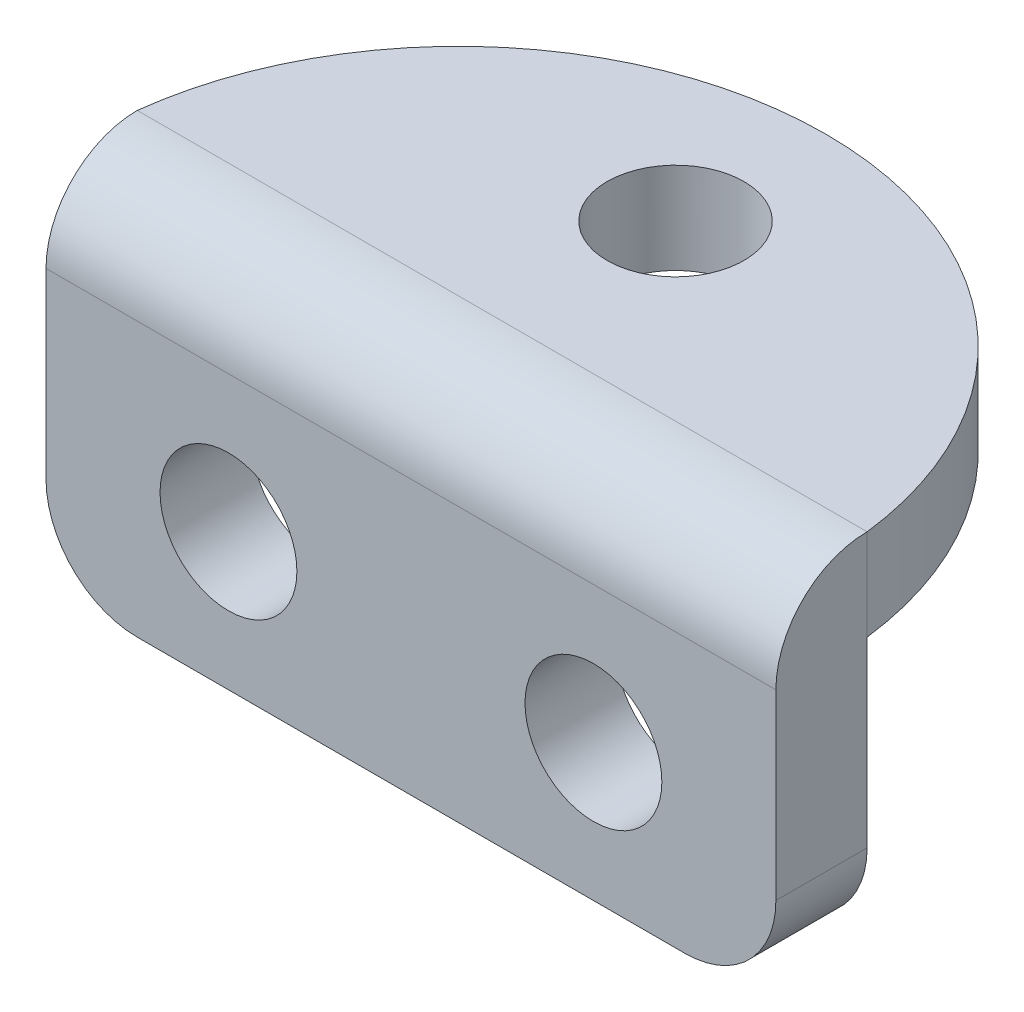
ISO-10303-21;
HEADER;
FILE_DESCRIPTION(('STEP AP214'),'2;1');
FILE_NAME('part.step','',(''),(''),'','','');
FILE_SCHEMA(('AUTOMOTIVE_DESIGN { 1 0 10303 214 1 1 1 1 }'));
ENDSEC;
DATA;
#1=APPLICATION_CONTEXT('core data for automotive mechanical design processes');
#2=APPLICATION_PROTOCOL_DEFINITION('international standard','automotive_design',2000,#1);
#3=PRODUCT_CONTEXT('',#1,'mechanical');
#4=PRODUCT('Part','Part','',(#3));
#5=PRODUCT_RELATED_PRODUCT_CATEGORY('part','',(#4));
#6=PRODUCT_DEFINITION_FORMATION('','',#4);
#7=PRODUCT_DEFINITION_CONTEXT('part definition',#1,'design');
#8=PRODUCT_DEFINITION('design','',#6,#7);
#9=PRODUCT_DEFINITION_SHAPE('','',#8);
#10=(LENGTH_UNIT() NAMED_UNIT(*) SI_UNIT(.MILLI.,.METRE.));
#11=(NAMED_UNIT(*) PLANE_ANGLE_UNIT() SI_UNIT($,.RADIAN.));
#12=(NAMED_UNIT(*) SI_UNIT($,.STERADIAN.) SOLID_ANGLE_UNIT());
#13=UNCERTAINTY_MEASURE_WITH_UNIT(LENGTH_MEASURE(1.E-05),#10,'distance_accuracy_value','');
#14=(GEOMETRIC_REPRESENTATION_CONTEXT(3) GLOBAL_UNCERTAINTY_ASSIGNED_CONTEXT((#13)) GLOBAL_UNIT_ASSIGNED_CONTEXT((#10,
#11,#12)) REPRESENTATION_CONTEXT('',''));
#15=CARTESIAN_POINT('',(0.,0.,0.));
#16=DIRECTION('',(0.,0.,1.));
#17=DIRECTION('',(1.,0.,0.));
#18=AXIS2_PLACEMENT_3D('',#15,#16,#17);
#19=CARTESIAN_POINT('',(0.,0.,2.));
#20=DIRECTION('',(1.,0.,0.));
#21=DIRECTION('',(0.,1.,0.));
#22=AXIS2_PLACEMENT_3D('',#19,#20,#21);
#23=PLANE('',#22);
#24=DIRECTION('',(0.,-1.,0.));
#25=VECTOR('',#24,1.);
#26=CARTESIAN_POINT('',(0.,0.,0.));
#27=LINE('',#26,#25);
#28=CARTESIAN_POINT('',(0.,2.,0.));
#29=VERTEX_POINT('',#28);
#30=CARTESIAN_POINT('',(0.,0.,0.));
#31=VERTEX_POINT('',#30);
#32=EDGE_CURVE('E112',#29,#31,#27,.T.);
#33=ORIENTED_EDGE('',*,*,#32,.T.);
#34=CARTESIAN_POINT('',(0.,-4.,0.));
#35=VERTEX_POINT('',#34);
#36=EDGE_CURVE('E116',#31,#35,#27,.T.);
#37=ORIENTED_EDGE('',*,*,#36,.T.);
#38=DIRECTION('',(0.,0.,-1.));
#39=VECTOR('',#38,1.);
#40=CARTESIAN_POINT('',(0.,-4.,2.));
#41=LINE('',#40,#39);
#42=CARTESIAN_POINT('',(0.,-4.,2.));
#43=VERTEX_POINT('',#42);
#44=EDGE_CURVE('E11',#43,#35,#41,.T.);
#45=ORIENTED_EDGE('',*,*,#44,.F.);
#46=DIRECTION('',(0.,-1.,0.));
#47=VECTOR('',#46,1.);
#48=CARTESIAN_POINT('',(0.,0.,2.));
#49=LINE('',#48,#47);
#50=CARTESIAN_POINT('',(0.,0.,2.));
#51=VERTEX_POINT('',#50);
#52=EDGE_CURVE('E86',#51,#43,#49,.T.);
#53=ORIENTED_EDGE('',*,*,#52,.F.);
#54=CARTESIAN_POINT('',(0.,0.,0.));
#55=DIRECTION('',(-1.,0.,0.));
#56=DIRECTION('',(0.,-1.,0.));
#57=AXIS2_PLACEMENT_3D('',#54,#55,#56);
#58=CIRCLE('',#57,2.);
#59=EDGE_CURVE('E162',#51,#29,#58,.T.);
#60=ORIENTED_EDGE('',*,*,#59,.T.);
#61=EDGE_LOOP('',(#33,#37,#45,#53,#60));
#62=FACE_BOUND('',#61,.T.);
#63=ADVANCED_FACE('F36',(#62),#23,.F.);
#64=CARTESIAN_POINT('',(2.,-4.,2.));
#65=DIRECTION('',(0.,0.,-1.));
#66=DIRECTION('',(-1.,0.,0.));
#67=AXIS2_PLACEMENT_3D('',#64,#65,#66);
#68=CYLINDRICAL_SURFACE('',#67,2.);
#69=CARTESIAN_POINT('',(2.,-4.,0.));
#70=DIRECTION('',(0.,0.,1.));
#71=DIRECTION('',(1.,0.,0.));
#72=AXIS2_PLACEMENT_3D('',#69,#70,#71);
#73=CIRCLE('',#72,2.);
#74=CARTESIAN_POINT('',(2.,-6.,0.));
#75=VERTEX_POINT('',#74);
#76=EDGE_CURVE('E115',#35,#75,#73,.T.);
#77=ORIENTED_EDGE('',*,*,#76,.T.);
#78=DIRECTION('',(0.,0.,-1.));
#79=VECTOR('',#78,1.);
#80=CARTESIAN_POINT('',(2.,-6.,2.));
#81=LINE('',#80,#79);
#82=CARTESIAN_POINT('',(2.,-6.,2.));
#83=VERTEX_POINT('',#82);
#84=EDGE_CURVE('E44',#83,#75,#81,.T.);
#85=ORIENTED_EDGE('',*,*,#84,.F.);
#86=CARTESIAN_POINT('',(2.,-4.,2.));
#87=DIRECTION('',(0.,0.,1.));
#88=DIRECTION('',(1.,0.,0.));
#89=AXIS2_PLACEMENT_3D('',#86,#87,#88);
#90=CIRCLE('',#89,2.);
#91=EDGE_CURVE('E100',#43,#83,#90,.T.);
#92=ORIENTED_EDGE('',*,*,#91,.F.);
#93=ORIENTED_EDGE('',*,*,#44,.T.);
#94=EDGE_LOOP('',(#77,#85,#92,#93));
#95=FACE_BOUND('',#94,.T.);
#96=ADVANCED_FACE('F185',(#95),#68,.T.);
#97=CARTESIAN_POINT('',(2.,-6.,2.));
#98=DIRECTION('',(0.,1.,0.));
#99=DIRECTION('',(0.,0.,1.));
#100=AXIS2_PLACEMENT_3D('',#97,#98,#99);
#101=PLANE('',#100);
#102=DIRECTION('',(1.,0.,0.));
#103=VECTOR('',#102,1.);
#104=CARTESIAN_POINT('',(2.,-6.,0.));
#105=LINE('',#104,#103);
#106=CARTESIAN_POINT('',(14.,-6.,0.));
#107=VERTEX_POINT('',#106);
#108=EDGE_CURVE('E70',#75,#107,#105,.T.);
#109=ORIENTED_EDGE('',*,*,#108,.T.);
#110=DIRECTION('',(0.,0.,-1.));
#111=VECTOR('',#110,1.);
#112=CARTESIAN_POINT('',(14.,-6.,2.));
#113=LINE('',#112,#111);
#114=CARTESIAN_POINT('',(14.,-6.,2.));
#115=VERTEX_POINT('',#114);
#116=EDGE_CURVE('E103',#115,#107,#113,.T.);
#117=ORIENTED_EDGE('',*,*,#116,.F.);
#118=DIRECTION('',(1.,0.,0.));
#119=VECTOR('',#118,1.);
#120=CARTESIAN_POINT('',(2.,-6.,2.));
#121=LINE('',#120,#119);
#122=EDGE_CURVE('E95',#83,#115,#121,.T.);
#123=ORIENTED_EDGE('',*,*,#122,.F.);
#124=ORIENTED_EDGE('',*,*,#84,.T.);
#125=EDGE_LOOP('',(#109,#117,#123,#124));
#126=FACE_BOUND('',#125,.T.);
#127=ADVANCED_FACE('F104',(#126),#101,.F.);
#128=CARTESIAN_POINT('',(14.,-4.,2.));
#129=DIRECTION('',(0.,0.,-1.));
#130=DIRECTION('',(-1.,0.,0.));
#131=AXIS2_PLACEMENT_3D('',#128,#129,#130);
#132=CYLINDRICAL_SURFACE('',#131,2.);
#133=CARTESIAN_POINT('',(14.,-4.,0.));
#134=DIRECTION('',(0.,0.,1.));
#135=DIRECTION('',(-1.,0.,0.));
#136=AXIS2_PLACEMENT_3D('',#133,#134,#135);
#137=CIRCLE('',#136,2.);
#138=CARTESIAN_POINT('',(16.,-4.,0.));
#139=VERTEX_POINT('',#138);
#140=EDGE_CURVE('E77',#107,#139,#137,.T.);
#141=ORIENTED_EDGE('',*,*,#140,.T.);
#142=DIRECTION('',(0.,0.,-1.));
#143=VECTOR('',#142,1.);
#144=CARTESIAN_POINT('',(16.,-4.,2.));
#145=LINE('',#144,#143);
#146=CARTESIAN_POINT('',(16.,-4.,2.));
#147=VERTEX_POINT('',#146);
#148=EDGE_CURVE('E105',#147,#139,#145,.T.);
#149=ORIENTED_EDGE('',*,*,#148,.F.);
#150=CARTESIAN_POINT('',(14.,-4.,2.));
#151=DIRECTION('',(0.,0.,1.));
#152=DIRECTION('',(-1.,0.,0.));
#153=AXIS2_PLACEMENT_3D('',#150,#151,#152);
#154=CIRCLE('',#153,2.);
#155=EDGE_CURVE('E98',#115,#147,#154,.T.);
#156=ORIENTED_EDGE('',*,*,#155,.F.);
#157=ORIENTED_EDGE('',*,*,#116,.T.);
#158=EDGE_LOOP('',(#141,#149,#156,#157));
#159=FACE_BOUND('',#158,.T.);
#160=ADVANCED_FACE('F107',(#159),#132,.T.);
#161=CARTESIAN_POINT('',(16.,-4.,2.));
#162=DIRECTION('',(-1.,0.,0.));
#163=DIRECTION('',(0.,0.,1.));
#164=AXIS2_PLACEMENT_3D('',#161,#162,#163);
#165=PLANE('',#164);
#166=DIRECTION('',(0.,1.,0.));
#167=VECTOR('',#166,1.);
#168=CARTESIAN_POINT('',(16.,-4.,0.));
#169=LINE('',#168,#167);
#170=CARTESIAN_POINT('',(16.,0.,0.));
#171=VERTEX_POINT('',#170);
#172=EDGE_CURVE('E120',#139,#171,#169,.T.);
#173=ORIENTED_EDGE('',*,*,#172,.T.);
#174=DIRECTION('',(0.,-1.,0.));
#175=VECTOR('',#174,1.);
#176=CARTESIAN_POINT('',(16.,2.,0.));
#177=LINE('',#176,#175);
#178=CARTESIAN_POINT('',(16.,2.,0.));
#179=VERTEX_POINT('',#178);
#180=EDGE_CURVE('E140',#179,#171,#177,.T.);
#181=ORIENTED_EDGE('',*,*,#180,.F.);
#182=CARTESIAN_POINT('',(16.,0.,0.));
#183=DIRECTION('',(-1.,0.,0.));
#184=DIRECTION('',(0.,-1.,0.));
#185=AXIS2_PLACEMENT_3D('',#182,#183,#184);
#186=CIRCLE('',#185,2.);
#187=CARTESIAN_POINT('',(16.,0.,2.));
#188=VERTEX_POINT('',#187);
#189=EDGE_CURVE('E165',#188,#179,#186,.T.);
#190=ORIENTED_EDGE('',*,*,#189,.F.);
#191=DIRECTION('',(0.,1.,0.));
#192=VECTOR('',#191,1.);
#193=CARTESIAN_POINT('',(16.,-4.,2.));
#194=LINE('',#193,#192);
#195=EDGE_CURVE('E52',#147,#188,#194,.T.);
#196=ORIENTED_EDGE('',*,*,#195,.F.);
#197=ORIENTED_EDGE('',*,*,#148,.T.);
#198=EDGE_LOOP('',(#173,#181,#190,#196,#197));
#199=FACE_BOUND('',#198,.T.);
#200=ADVANCED_FACE('F136',(#199),#165,.F.);
#201=CARTESIAN_POINT('',(2.,-4.,2.));
#202=DIRECTION('',(0.,0.,1.));
#203=DIRECTION('',(1.,0.,0.));
#204=AXIS2_PLACEMENT_3D('',#201,#202,#203);
#205=PLANE('',#204);
#206=CARTESIAN_POINT('',(12.,-3.,2.));
#207=DIRECTION('',(0.,0.,1.));
#208=DIRECTION('',(1.,0.,0.));
#209=AXIS2_PLACEMENT_3D('',#206,#207,#208);
#210=CIRCLE('',#209,1.5);
#211=CARTESIAN_POINT('',(13.5,-3.,2.));
#212=VERTEX_POINT('',#211);
#213=EDGE_CURVE('E160',#212,#212,#210,.T.);
#214=ORIENTED_EDGE('',*,*,#213,.F.);
#215=EDGE_LOOP('',(#214));
#216=FACE_BOUND('',#215,.T.);
#217=CARTESIAN_POINT('',(4.,-3.,2.));
#218=DIRECTION('',(0.,0.,1.));
#219=DIRECTION('',(1.,0.,0.));
#220=AXIS2_PLACEMENT_3D('',#217,#218,#219);
#221=CIRCLE('',#220,1.5);
#222=CARTESIAN_POINT('',(5.5,-3.,2.));
#223=VERTEX_POINT('',#222);
#224=EDGE_CURVE('E177',#223,#223,#221,.T.);
#225=ORIENTED_EDGE('',*,*,#224,.F.);
#226=EDGE_LOOP('',(#225));
#227=FACE_BOUND('',#226,.T.);
#228=DIRECTION('',(-1.,0.,0.));
#229=VECTOR('',#228,1.);
#230=CARTESIAN_POINT('',(16.,0.,2.));
#231=LINE('',#230,#229);
#232=EDGE_CURVE('E123',#188,#51,#231,.T.);
#233=ORIENTED_EDGE('',*,*,#232,.T.);
#234=ORIENTED_EDGE('',*,*,#52,.T.);
#235=ORIENTED_EDGE('',*,*,#91,.T.);
#236=ORIENTED_EDGE('',*,*,#122,.T.);
#237=ORIENTED_EDGE('',*,*,#155,.T.);
#238=ORIENTED_EDGE('',*,*,#195,.T.);
#239=EDGE_LOOP('',(#233,#234,#235,#236,#237,#238));
#240=FACE_BOUND('',#239,.T.);
#241=ADVANCED_FACE('F96',(#216,#227,#240),#205,.T.);
#242=CARTESIAN_POINT('',(2.,-4.,0.));
#243=DIRECTION('',(0.,0.,1.));
#244=DIRECTION('',(1.,0.,0.));
#245=AXIS2_PLACEMENT_3D('',#242,#243,#244);
#246=PLANE('',#245);
#247=CARTESIAN_POINT('',(12.,-3.,0.));
#248=DIRECTION('',(0.,0.,-1.));
#249=DIRECTION('',(-1.,0.,0.));
#250=AXIS2_PLACEMENT_3D('',#247,#248,#249);
#251=CIRCLE('',#250,1.5);
#252=CARTESIAN_POINT('',(10.5,-3.,0.));
#253=VERTEX_POINT('',#252);
#254=EDGE_CURVE('E174',#253,#253,#251,.T.);
#255=ORIENTED_EDGE('',*,*,#254,.F.);
#256=EDGE_LOOP('',(#255));
#257=FACE_BOUND('',#256,.T.);
#258=CARTESIAN_POINT('',(4.,-3.,0.));
#259=DIRECTION('',(0.,0.,-1.));
#260=DIRECTION('',(-1.,0.,0.));
#261=AXIS2_PLACEMENT_3D('',#258,#259,#260);
#262=CIRCLE('',#261,1.5);
#263=CARTESIAN_POINT('',(2.5,-3.,0.));
#264=VERTEX_POINT('',#263);
#265=EDGE_CURVE('E173',#264,#264,#262,.T.);
#266=ORIENTED_EDGE('',*,*,#265,.F.);
#267=EDGE_LOOP('',(#266));
#268=FACE_BOUND('',#267,.T.);
#269=ORIENTED_EDGE('',*,*,#36,.F.);
#270=DIRECTION('',(1.,0.,0.));
#271=VECTOR('',#270,1.);
#272=CARTESIAN_POINT('',(0.,0.,0.));
#273=LINE('',#272,#271);
#274=EDGE_CURVE('E133',#31,#171,#273,.T.);
#275=ORIENTED_EDGE('',*,*,#274,.T.);
#276=ORIENTED_EDGE('',*,*,#172,.F.);
#277=ORIENTED_EDGE('',*,*,#140,.F.);
#278=ORIENTED_EDGE('',*,*,#108,.F.);
#279=ORIENTED_EDGE('',*,*,#76,.F.);
#280=EDGE_LOOP('',(#269,#275,#276,#277,#278,#279));
#281=FACE_BOUND('',#280,.T.);
#282=ADVANCED_FACE('F128',(#257,#268,#281),#246,.F.);
#283=CARTESIAN_POINT('',(4.,-3.,10.));
#284=DIRECTION('',(0.,0.,-1.));
#285=DIRECTION('',(-1.,0.,0.));
#286=AXIS2_PLACEMENT_3D('',#283,#284,#285);
#287=CYLINDRICAL_SURFACE('',#286,1.5);
#288=ORIENTED_EDGE('',*,*,#224,.T.);
#289=EDGE_LOOP('',(#288));
#290=FACE_BOUND('',#289,.T.);
#291=ORIENTED_EDGE('',*,*,#265,.T.);
#292=EDGE_LOOP('',(#291));
#293=FACE_BOUND('',#292,.T.);
#294=ADVANCED_FACE('F199',(#290,#293),#287,.F.);
#295=CARTESIAN_POINT('',(12.,-3.,10.));
#296=DIRECTION('',(0.,0.,-1.));
#297=DIRECTION('',(-1.,0.,0.));
#298=AXIS2_PLACEMENT_3D('',#295,#296,#297);
#299=CYLINDRICAL_SURFACE('',#298,1.5);
#300=ORIENTED_EDGE('',*,*,#213,.T.);
#301=EDGE_LOOP('',(#300));
#302=FACE_BOUND('',#301,.T.);
#303=ORIENTED_EDGE('',*,*,#254,.T.);
#304=EDGE_LOOP('',(#303));
#305=FACE_BOUND('',#304,.T.);
#306=ADVANCED_FACE('F206',(#302,#305),#299,.F.);
#307=CARTESIAN_POINT('',(16.,0.,0.));
#308=DIRECTION('',(-1.,0.,0.));
#309=DIRECTION('',(0.,-1.,0.));
#310=AXIS2_PLACEMENT_3D('',#307,#308,#309);
#311=CYLINDRICAL_SURFACE('',#310,2.);
#312=ORIENTED_EDGE('',*,*,#59,.F.);
#313=ORIENTED_EDGE('',*,*,#232,.F.);
#314=ORIENTED_EDGE('',*,*,#189,.T.);
#315=DIRECTION('',(-1.,0.,0.));
#316=VECTOR('',#315,1.);
#317=CARTESIAN_POINT('',(16.,2.,0.));
#318=LINE('',#317,#316);
#319=EDGE_CURVE('E167',#179,#29,#318,.T.);
#320=ORIENTED_EDGE('',*,*,#319,.T.);
#321=EDGE_LOOP('',(#312,#313,#314,#320));
#322=FACE_BOUND('',#321,.T.);
#323=ADVANCED_FACE('F210',(#322),#311,.T.);
#324=CARTESIAN_POINT('',(8.,2.,0.959848869791568));
#325=DIRECTION('',(0.,-1.,0.));
#326=DIRECTION('',(1.,0.,0.));
#327=AXIS2_PLACEMENT_3D('',#324,#325,#326);
#328=CYLINDRICAL_SURFACE('',#327,8.05737611464428);
#329=CARTESIAN_POINT('',(8.,0.,0.959848869791568));
#330=DIRECTION('',(0.,1.,0.));
#331=DIRECTION('',(1.,0.,0.));
#332=AXIS2_PLACEMENT_3D('',#329,#330,#331);
#333=CIRCLE('',#332,8.05737611464428);
#334=EDGE_CURVE('E152',#171,#31,#333,.T.);
#335=ORIENTED_EDGE('',*,*,#334,.T.);
#336=ORIENTED_EDGE('',*,*,#32,.F.);
#337=CARTESIAN_POINT('',(8.,2.,0.959848869791568));
#338=DIRECTION('',(0.,1.,0.));
#339=DIRECTION('',(1.,0.,0.));
#340=AXIS2_PLACEMENT_3D('',#337,#338,#339);
#341=CIRCLE('',#340,8.05737611464428);
#342=EDGE_CURVE('E153',#179,#29,#341,.T.);
#343=ORIENTED_EDGE('',*,*,#342,.F.);
#344=ORIENTED_EDGE('',*,*,#180,.T.);
#345=EDGE_LOOP('',(#335,#336,#343,#344));
#346=FACE_BOUND('',#345,.T.);
#347=ADVANCED_FACE('F156',(#346),#328,.T.);
#348=CARTESIAN_POINT('',(8.,2.,0.959848869791568));
#349=DIRECTION('',(0.,-1.,0.));
#350=DIRECTION('',(1.,0.,0.));
#351=AXIS2_PLACEMENT_3D('',#348,#349,#350);
#352=PLANE('',#351);
#353=CARTESIAN_POINT('',(8.,2.,-3.8));
#354=DIRECTION('',(0.,1.,0.));
#355=DIRECTION('',(-1.,0.,0.));
#356=AXIS2_PLACEMENT_3D('',#353,#354,#355);
#357=CIRCLE('',#356,1.5);
#358=CARTESIAN_POINT('',(6.5,2.,-3.8));
#359=VERTEX_POINT('',#358);
#360=EDGE_CURVE('E233',#359,#359,#357,.T.);
#361=ORIENTED_EDGE('',*,*,#360,.F.);
#362=EDGE_LOOP('',(#361));
#363=FACE_BOUND('',#362,.T.);
#364=ORIENTED_EDGE('',*,*,#342,.T.);
#365=ORIENTED_EDGE('',*,*,#319,.F.);
#366=EDGE_LOOP('',(#364,#365));
#367=FACE_BOUND('',#366,.T.);
#368=ADVANCED_FACE('F216',(#363,#367),#352,.F.);
#369=CARTESIAN_POINT('',(8.,0.,0.959848869791568));
#370=DIRECTION('',(0.,-1.,0.));
#371=DIRECTION('',(1.,0.,0.));
#372=AXIS2_PLACEMENT_3D('',#369,#370,#371);
#373=PLANE('',#372);
#374=CARTESIAN_POINT('',(8.,0.,-3.8));
#375=DIRECTION('',(0.,-1.,0.));
#376=DIRECTION('',(1.,0.,0.));
#377=AXIS2_PLACEMENT_3D('',#374,#375,#376);
#378=CIRCLE('',#377,1.5);
#379=CARTESIAN_POINT('',(9.5,0.,-3.8));
#380=VERTEX_POINT('',#379);
#381=EDGE_CURVE('E158',#380,#380,#378,.T.);
#382=ORIENTED_EDGE('',*,*,#381,.F.);
#383=EDGE_LOOP('',(#382));
#384=FACE_BOUND('',#383,.T.);
#385=ORIENTED_EDGE('',*,*,#334,.F.);
#386=ORIENTED_EDGE('',*,*,#274,.F.);
#387=EDGE_LOOP('',(#385,#386));
#388=FACE_BOUND('',#387,.T.);
#389=ADVANCED_FACE('F151',(#384,#388),#373,.T.);
#390=CARTESIAN_POINT('',(8.,-8.,-3.8));
#391=DIRECTION('',(0.,1.,0.));
#392=DIRECTION('',(-1.,0.,0.));
#393=AXIS2_PLACEMENT_3D('',#390,#391,#392);
#394=CYLINDRICAL_SURFACE('',#393,1.5);
#395=ORIENTED_EDGE('',*,*,#381,.T.);
#396=EDGE_LOOP('',(#395));
#397=FACE_BOUND('',#396,.T.);
#398=ORIENTED_EDGE('',*,*,#360,.T.);
#399=EDGE_LOOP('',(#398));
#400=FACE_BOUND('',#399,.T.);
#401=ADVANCED_FACE('F219',(#397,#400),#394,.F.);
#402=CLOSED_SHELL('',(#63,#96,#127,#160,#200,#241,#282,#294,#306,#323,#347,#368,#389,#401));
#403=MANIFOLD_SOLID_BREP('B2',#402);
#404=ADVANCED_BREP_SHAPE_REPRESENTATION('',(#18,#403),#14);
#405=SHAPE_DEFINITION_REPRESENTATION(#9,#404);
ENDSEC;
END-ISO-10303-21;
